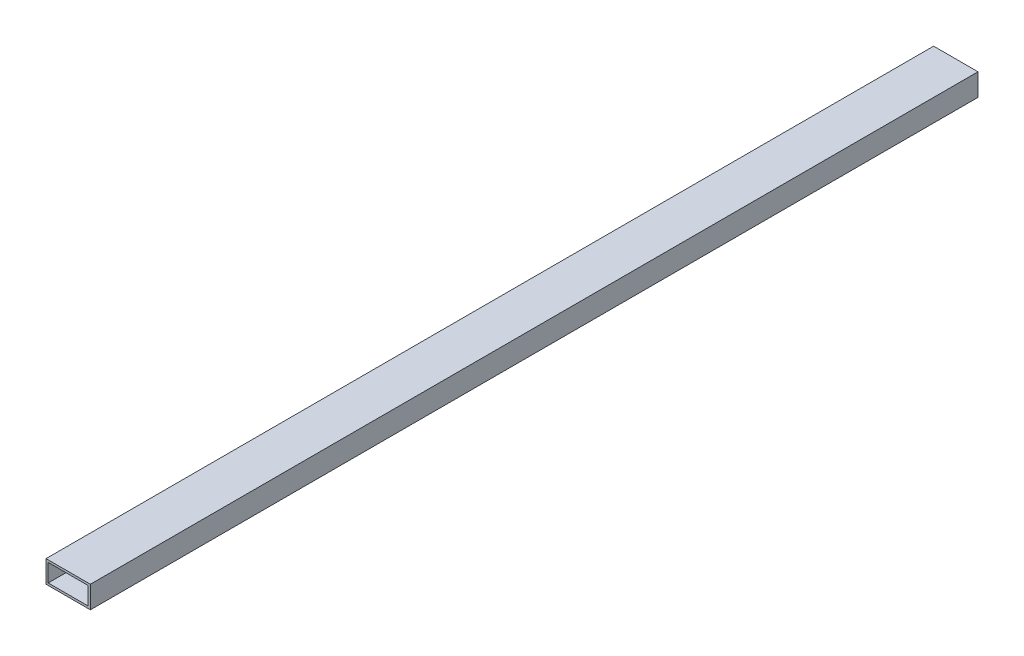
ISO-10303-21;
HEADER;
FILE_DESCRIPTION(('STEP AP214'),'2;1');
FILE_NAME('part.step','',(''),(''),'','','');
FILE_SCHEMA(('AUTOMOTIVE_DESIGN { 1 0 10303 214 1 1 1 1 }'));
ENDSEC;
DATA;
#1=APPLICATION_CONTEXT('core data for automotive mechanical design processes');
#2=APPLICATION_PROTOCOL_DEFINITION('international standard','automotive_design',2000,#1);
#3=PRODUCT_CONTEXT('',#1,'mechanical');
#4=PRODUCT('Part','Part','',(#3));
#5=PRODUCT_RELATED_PRODUCT_CATEGORY('part','',(#4));
#6=PRODUCT_DEFINITION_FORMATION('','',#4);
#7=PRODUCT_DEFINITION_CONTEXT('part definition',#1,'design');
#8=PRODUCT_DEFINITION('design','',#6,#7);
#9=PRODUCT_DEFINITION_SHAPE('','',#8);
#10=(LENGTH_UNIT() NAMED_UNIT(*) SI_UNIT(.MILLI.,.METRE.));
#11=(NAMED_UNIT(*) PLANE_ANGLE_UNIT() SI_UNIT($,.RADIAN.));
#12=(NAMED_UNIT(*) SI_UNIT($,.STERADIAN.) SOLID_ANGLE_UNIT());
#13=UNCERTAINTY_MEASURE_WITH_UNIT(LENGTH_MEASURE(1.E-05),#10,'distance_accuracy_value','');
#14=(GEOMETRIC_REPRESENTATION_CONTEXT(3) GLOBAL_UNCERTAINTY_ASSIGNED_CONTEXT((#13)) GLOBAL_UNIT_ASSIGNED_CONTEXT((#10,
#11,#12)) REPRESENTATION_CONTEXT('',''));
#15=CARTESIAN_POINT('',(0.,0.,0.));
#16=DIRECTION('',(0.,0.,1.));
#17=DIRECTION('',(1.,0.,0.));
#18=AXIS2_PLACEMENT_3D('',#15,#16,#17);
#19=CARTESIAN_POINT('',(0.,0.,800.));
#20=DIRECTION('',(0.,0.,1.));
#21=DIRECTION('',(1.,0.,0.));
#22=AXIS2_PLACEMENT_3D('',#19,#20,#21);
#23=PLANE('',#22);
#24=DIRECTION('',(0.,-1.,0.));
#25=VECTOR('',#24,1.);
#26=CARTESIAN_POINT('',(-32.1254557149082,-7.36040974529348,800.));
#27=LINE('',#26,#25);
#28=CARTESIAN_POINT('',(-32.1254557149082,-7.36040974529348,800.));
#29=VERTEX_POINT('',#28);
#30=CARTESIAN_POINT('',(-32.1254557149083,-27.3604097452935,800.));
#31=VERTEX_POINT('',#30);
#32=EDGE_CURVE('E134',#29,#31,#27,.T.);
#33=ORIENTED_EDGE('',*,*,#32,.T.);
#34=DIRECTION('',(1.,0.,0.));
#35=VECTOR('',#34,1.);
#36=CARTESIAN_POINT('',(-32.1254557149083,-27.3604097452935,800.));
#37=LINE('',#36,#35);
#38=CARTESIAN_POINT('',(7.87454428509174,-27.3604097452935,800.));
#39=VERTEX_POINT('',#38);
#40=EDGE_CURVE('E137',#31,#39,#37,.T.);
#41=ORIENTED_EDGE('',*,*,#40,.T.);
#42=DIRECTION('',(0.,1.,0.));
#43=VECTOR('',#42,1.);
#44=CARTESIAN_POINT('',(7.87454428509175,-7.36040974529348,800.));
#45=LINE('',#44,#43);
#46=CARTESIAN_POINT('',(7.87454428509175,-7.36040974529348,800.));
#47=VERTEX_POINT('',#46);
#48=EDGE_CURVE('E140',#39,#47,#45,.T.);
#49=ORIENTED_EDGE('',*,*,#48,.T.);
#50=DIRECTION('',(-1.,0.,0.));
#51=VECTOR('',#50,1.);
#52=CARTESIAN_POINT('',(-32.1254557149082,-7.36040974529348,800.));
#53=LINE('',#52,#51);
#54=EDGE_CURVE('E142',#47,#29,#53,.T.);
#55=ORIENTED_EDGE('',*,*,#54,.T.);
#56=EDGE_LOOP('',(#33,#41,#49,#55));
#57=FACE_BOUND('',#56,.T.);
#58=DIRECTION('',(1.,0.,0.));
#59=VECTOR('',#58,1.);
#60=CARTESIAN_POINT('',(-30.1254557149082,-25.3604097452935,800.));
#61=LINE('',#60,#59);
#62=CARTESIAN_POINT('',(-30.1254557149082,-25.3604097452935,800.));
#63=VERTEX_POINT('',#62);
#64=CARTESIAN_POINT('',(5.87454428509175,-25.3604097452935,800.));
#65=VERTEX_POINT('',#64);
#66=EDGE_CURVE('E106',#63,#65,#61,.T.);
#67=ORIENTED_EDGE('',*,*,#66,.F.);
#68=DIRECTION('',(0.,-1.,0.));
#69=VECTOR('',#68,1.);
#70=CARTESIAN_POINT('',(-30.1254557149082,-9.36040974529348,800.));
#71=LINE('',#70,#69);
#72=CARTESIAN_POINT('',(-30.1254557149082,-9.36040974529348,800.));
#73=VERTEX_POINT('',#72);
#74=EDGE_CURVE('E98',#73,#63,#71,.T.);
#75=ORIENTED_EDGE('',*,*,#74,.F.);
#76=DIRECTION('',(-1.,0.,0.));
#77=VECTOR('',#76,1.);
#78=CARTESIAN_POINT('',(-30.1254557149082,-9.36040974529348,800.));
#79=LINE('',#78,#77);
#80=CARTESIAN_POINT('',(5.87454428509175,-9.36040974529348,800.));
#81=VERTEX_POINT('',#80);
#82=EDGE_CURVE('E120',#81,#73,#79,.T.);
#83=ORIENTED_EDGE('',*,*,#82,.F.);
#84=DIRECTION('',(0.,1.,0.));
#85=VECTOR('',#84,1.);
#86=CARTESIAN_POINT('',(5.87454428509175,-9.36040974529348,800.));
#87=LINE('',#86,#85);
#88=EDGE_CURVE('E118',#65,#81,#87,.T.);
#89=ORIENTED_EDGE('',*,*,#88,.F.);
#90=EDGE_LOOP('',(#67,#75,#83,#89));
#91=FACE_BOUND('',#90,.T.);
#92=ADVANCED_FACE('F33',(#57,#91),#23,.T.);
#93=CARTESIAN_POINT('',(0.,0.,0.));
#94=DIRECTION('',(0.,0.,1.));
#95=DIRECTION('',(1.,0.,0.));
#96=AXIS2_PLACEMENT_3D('',#93,#94,#95);
#97=PLANE('',#96);
#98=DIRECTION('',(0.,-1.,0.));
#99=VECTOR('',#98,1.);
#100=CARTESIAN_POINT('',(-32.1254557149082,-7.36040974529348,0.));
#101=LINE('',#100,#99);
#102=CARTESIAN_POINT('',(-32.1254557149082,-7.36040974529348,0.));
#103=VERTEX_POINT('',#102);
#104=CARTESIAN_POINT('',(-32.1254557149083,-27.3604097452935,0.));
#105=VERTEX_POINT('',#104);
#106=EDGE_CURVE('E114',#103,#105,#101,.T.);
#107=ORIENTED_EDGE('',*,*,#106,.F.);
#108=DIRECTION('',(-1.,0.,0.));
#109=VECTOR('',#108,1.);
#110=CARTESIAN_POINT('',(-32.1254557149082,-7.36040974529348,0.));
#111=LINE('',#110,#109);
#112=CARTESIAN_POINT('',(7.87454428509175,-7.36040974529348,0.));
#113=VERTEX_POINT('',#112);
#114=EDGE_CURVE('E138',#113,#103,#111,.T.);
#115=ORIENTED_EDGE('',*,*,#114,.F.);
#116=DIRECTION('',(0.,1.,0.));
#117=VECTOR('',#116,1.);
#118=CARTESIAN_POINT('',(7.87454428509175,-7.36040974529348,0.));
#119=LINE('',#118,#117);
#120=CARTESIAN_POINT('',(7.87454428509174,-27.3604097452935,0.));
#121=VERTEX_POINT('',#120);
#122=EDGE_CURVE('E149',#121,#113,#119,.T.);
#123=ORIENTED_EDGE('',*,*,#122,.F.);
#124=DIRECTION('',(1.,0.,0.));
#125=VECTOR('',#124,1.);
#126=CARTESIAN_POINT('',(-32.1254557149083,-27.3604097452935,0.));
#127=LINE('',#126,#125);
#128=EDGE_CURVE('E147',#105,#121,#127,.T.);
#129=ORIENTED_EDGE('',*,*,#128,.F.);
#130=EDGE_LOOP('',(#107,#115,#123,#129));
#131=FACE_BOUND('',#130,.T.);
#132=DIRECTION('',(0.,-1.,0.));
#133=VECTOR('',#132,1.);
#134=CARTESIAN_POINT('',(-30.1254557149082,-9.36040974529348,0.));
#135=LINE('',#134,#133);
#136=CARTESIAN_POINT('',(-30.1254557149082,-9.36040974529348,0.));
#137=VERTEX_POINT('',#136);
#138=CARTESIAN_POINT('',(-30.1254557149082,-25.3604097452935,0.));
#139=VERTEX_POINT('',#138);
#140=EDGE_CURVE('E56',#137,#139,#135,.T.);
#141=ORIENTED_EDGE('',*,*,#140,.T.);
#142=DIRECTION('',(1.,0.,0.));
#143=VECTOR('',#142,1.);
#144=CARTESIAN_POINT('',(-30.1254557149082,-25.3604097452935,0.));
#145=LINE('',#144,#143);
#146=CARTESIAN_POINT('',(5.87454428509175,-25.3604097452935,0.));
#147=VERTEX_POINT('',#146);
#148=EDGE_CURVE('E113',#139,#147,#145,.T.);
#149=ORIENTED_EDGE('',*,*,#148,.T.);
#150=DIRECTION('',(0.,1.,0.));
#151=VECTOR('',#150,1.);
#152=CARTESIAN_POINT('',(5.87454428509175,-9.36040974529348,0.));
#153=LINE('',#152,#151);
#154=CARTESIAN_POINT('',(5.87454428509175,-9.36040974529348,0.));
#155=VERTEX_POINT('',#154);
#156=EDGE_CURVE('E126',#147,#155,#153,.T.);
#157=ORIENTED_EDGE('',*,*,#156,.T.);
#158=DIRECTION('',(-1.,0.,0.));
#159=VECTOR('',#158,1.);
#160=CARTESIAN_POINT('',(-30.1254557149082,-9.36040974529348,0.));
#161=LINE('',#160,#159);
#162=EDGE_CURVE('E107',#155,#137,#161,.T.);
#163=ORIENTED_EDGE('',*,*,#162,.T.);
#164=EDGE_LOOP('',(#141,#149,#157,#163));
#165=FACE_BOUND('',#164,.T.);
#166=ADVANCED_FACE('F167',(#131,#165),#97,.F.);
#167=CARTESIAN_POINT('',(-32.1254557149082,-7.36040974529348,800.));
#168=DIRECTION('',(1.,0.,0.));
#169=DIRECTION('',(0.,1.,0.));
#170=AXIS2_PLACEMENT_3D('',#167,#168,#169);
#171=PLANE('',#170);
#172=ORIENTED_EDGE('',*,*,#106,.T.);
#173=DIRECTION('',(0.,0.,-1.));
#174=VECTOR('',#173,1.);
#175=CARTESIAN_POINT('',(-32.1254557149083,-27.3604097452935,800.));
#176=LINE('',#175,#174);
#177=EDGE_CURVE('E11',#31,#105,#176,.T.);
#178=ORIENTED_EDGE('',*,*,#177,.F.);
#179=ORIENTED_EDGE('',*,*,#32,.F.);
#180=DIRECTION('',(0.,0.,-1.));
#181=VECTOR('',#180,1.);
#182=CARTESIAN_POINT('',(-32.1254557149082,-7.36040974529348,800.));
#183=LINE('',#182,#181);
#184=EDGE_CURVE('E144',#29,#103,#183,.T.);
#185=ORIENTED_EDGE('',*,*,#184,.T.);
#186=EDGE_LOOP('',(#172,#178,#179,#185));
#187=FACE_BOUND('',#186,.T.);
#188=ADVANCED_FACE('F35',(#187),#171,.F.);
#189=CARTESIAN_POINT('',(-32.1254557149083,-27.3604097452935,800.));
#190=DIRECTION('',(0.,1.,0.));
#191=DIRECTION('',(0.,0.,1.));
#192=AXIS2_PLACEMENT_3D('',#189,#190,#191);
#193=PLANE('',#192);
#194=ORIENTED_EDGE('',*,*,#128,.T.);
#195=DIRECTION('',(0.,0.,-1.));
#196=VECTOR('',#195,1.);
#197=CARTESIAN_POINT('',(7.87454428509174,-27.3604097452935,800.));
#198=LINE('',#197,#196);
#199=EDGE_CURVE('E41',#39,#121,#198,.T.);
#200=ORIENTED_EDGE('',*,*,#199,.F.);
#201=ORIENTED_EDGE('',*,*,#40,.F.);
#202=ORIENTED_EDGE('',*,*,#177,.T.);
#203=EDGE_LOOP('',(#194,#200,#201,#202));
#204=FACE_BOUND('',#203,.T.);
#205=ADVANCED_FACE('F177',(#204),#193,.F.);
#206=CARTESIAN_POINT('',(7.87454428509175,-7.36040974529348,800.));
#207=DIRECTION('',(-1.,0.,0.));
#208=DIRECTION('',(0.,-1.,0.));
#209=AXIS2_PLACEMENT_3D('',#206,#207,#208);
#210=PLANE('',#209);
#211=ORIENTED_EDGE('',*,*,#122,.T.);
#212=DIRECTION('',(0.,0.,-1.));
#213=VECTOR('',#212,1.);
#214=CARTESIAN_POINT('',(7.87454428509175,-7.36040974529348,800.));
#215=LINE('',#214,#213);
#216=EDGE_CURVE('E154',#47,#113,#215,.T.);
#217=ORIENTED_EDGE('',*,*,#216,.F.);
#218=ORIENTED_EDGE('',*,*,#48,.F.);
#219=ORIENTED_EDGE('',*,*,#199,.T.);
#220=EDGE_LOOP('',(#211,#217,#218,#219));
#221=FACE_BOUND('',#220,.T.);
#222=ADVANCED_FACE('F161',(#221),#210,.F.);
#223=CARTESIAN_POINT('',(-32.1254557149082,-7.36040974529348,800.));
#224=DIRECTION('',(0.,-1.,0.));
#225=DIRECTION('',(1.,0.,0.));
#226=AXIS2_PLACEMENT_3D('',#223,#224,#225);
#227=PLANE('',#226);
#228=ORIENTED_EDGE('',*,*,#114,.T.);
#229=ORIENTED_EDGE('',*,*,#184,.F.);
#230=ORIENTED_EDGE('',*,*,#54,.F.);
#231=ORIENTED_EDGE('',*,*,#216,.T.);
#232=EDGE_LOOP('',(#228,#229,#230,#231));
#233=FACE_BOUND('',#232,.T.);
#234=ADVANCED_FACE('F171',(#233),#227,.F.);
#235=CARTESIAN_POINT('',(-30.1254557149082,-9.36040974529348,800.));
#236=DIRECTION('',(1.,0.,0.));
#237=DIRECTION('',(0.,0.,-1.));
#238=AXIS2_PLACEMENT_3D('',#235,#236,#237);
#239=PLANE('',#238);
#240=ORIENTED_EDGE('',*,*,#140,.F.);
#241=DIRECTION('',(0.,0.,-1.));
#242=VECTOR('',#241,1.);
#243=CARTESIAN_POINT('',(-30.1254557149082,-9.36040974529348,800.));
#244=LINE('',#243,#242);
#245=EDGE_CURVE('E102',#73,#137,#244,.T.);
#246=ORIENTED_EDGE('',*,*,#245,.F.);
#247=ORIENTED_EDGE('',*,*,#74,.T.);
#248=DIRECTION('',(0.,0.,-1.));
#249=VECTOR('',#248,1.);
#250=CARTESIAN_POINT('',(-30.1254557149082,-25.3604097452935,800.));
#251=LINE('',#250,#249);
#252=EDGE_CURVE('E101',#63,#139,#251,.T.);
#253=ORIENTED_EDGE('',*,*,#252,.T.);
#254=EDGE_LOOP('',(#240,#246,#247,#253));
#255=FACE_BOUND('',#254,.T.);
#256=ADVANCED_FACE('F100',(#255),#239,.T.);
#257=CARTESIAN_POINT('',(-30.1254557149082,-25.3604097452935,800.));
#258=DIRECTION('',(0.,1.,0.));
#259=DIRECTION('',(0.,0.,1.));
#260=AXIS2_PLACEMENT_3D('',#257,#258,#259);
#261=PLANE('',#260);
#262=ORIENTED_EDGE('',*,*,#148,.F.);
#263=ORIENTED_EDGE('',*,*,#252,.F.);
#264=ORIENTED_EDGE('',*,*,#66,.T.);
#265=DIRECTION('',(0.,0.,-1.));
#266=VECTOR('',#265,1.);
#267=CARTESIAN_POINT('',(5.87454428509175,-25.3604097452935,800.));
#268=LINE('',#267,#266);
#269=EDGE_CURVE('E115',#65,#147,#268,.T.);
#270=ORIENTED_EDGE('',*,*,#269,.T.);
#271=EDGE_LOOP('',(#262,#263,#264,#270));
#272=FACE_BOUND('',#271,.T.);
#273=ADVANCED_FACE('F110',(#272),#261,.T.);
#274=CARTESIAN_POINT('',(5.87454428509175,-9.36040974529348,800.));
#275=DIRECTION('',(-1.,0.,0.));
#276=DIRECTION('',(0.,0.,1.));
#277=AXIS2_PLACEMENT_3D('',#274,#275,#276);
#278=PLANE('',#277);
#279=ORIENTED_EDGE('',*,*,#156,.F.);
#280=ORIENTED_EDGE('',*,*,#269,.F.);
#281=ORIENTED_EDGE('',*,*,#88,.T.);
#282=DIRECTION('',(0.,0.,-1.));
#283=VECTOR('',#282,1.);
#284=CARTESIAN_POINT('',(5.87454428509175,-9.36040974529348,800.));
#285=LINE('',#284,#283);
#286=EDGE_CURVE('E48',#81,#155,#285,.T.);
#287=ORIENTED_EDGE('',*,*,#286,.T.);
#288=EDGE_LOOP('',(#279,#280,#281,#287));
#289=FACE_BOUND('',#288,.T.);
#290=ADVANCED_FACE('F200',(#289),#278,.T.);
#291=CARTESIAN_POINT('',(-30.1254557149082,-9.36040974529348,800.));
#292=DIRECTION('',(0.,-1.,0.));
#293=DIRECTION('',(1.,0.,0.));
#294=AXIS2_PLACEMENT_3D('',#291,#292,#293);
#295=PLANE('',#294);
#296=ORIENTED_EDGE('',*,*,#162,.F.);
#297=ORIENTED_EDGE('',*,*,#286,.F.);
#298=ORIENTED_EDGE('',*,*,#82,.T.);
#299=ORIENTED_EDGE('',*,*,#245,.T.);
#300=EDGE_LOOP('',(#296,#297,#298,#299));
#301=FACE_BOUND('',#300,.T.);
#302=ADVANCED_FACE('F204',(#301),#295,.T.);
#303=CLOSED_SHELL('',(#92,#166,#188,#205,#222,#234,#256,#273,#290,#302));
#304=MANIFOLD_SOLID_BREP('B2',#303);
#305=ADVANCED_BREP_SHAPE_REPRESENTATION('',(#18,#304),#14);
#306=SHAPE_DEFINITION_REPRESENTATION(#9,#305);
ENDSEC;
END-ISO-10303-21;
